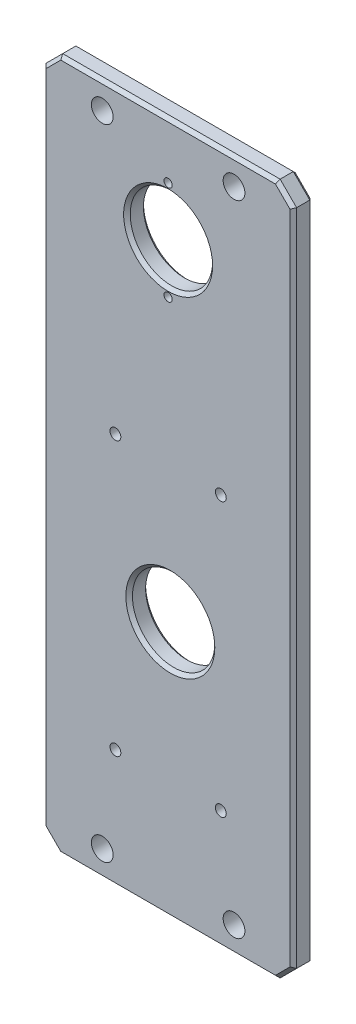
ISO-10303-21;
HEADER;
FILE_DESCRIPTION(('STEP AP214'),'2;1');
FILE_NAME('part.step','',(''),(''),'','','');
FILE_SCHEMA(('AUTOMOTIVE_DESIGN { 1 0 10303 214 1 1 1 1 }'));
ENDSEC;
DATA;
#1=APPLICATION_CONTEXT('core data for automotive mechanical design processes');
#2=APPLICATION_PROTOCOL_DEFINITION('international standard','automotive_design',2000,#1);
#3=PRODUCT_CONTEXT('',#1,'mechanical');
#4=PRODUCT('Part','Part','',(#3));
#5=PRODUCT_RELATED_PRODUCT_CATEGORY('part','',(#4));
#6=PRODUCT_DEFINITION_FORMATION('','',#4);
#7=PRODUCT_DEFINITION_CONTEXT('part definition',#1,'design');
#8=PRODUCT_DEFINITION('design','',#6,#7);
#9=PRODUCT_DEFINITION_SHAPE('','',#8);
#10=(LENGTH_UNIT() NAMED_UNIT(*) SI_UNIT(.MILLI.,.METRE.));
#11=(NAMED_UNIT(*) PLANE_ANGLE_UNIT() SI_UNIT($,.RADIAN.));
#12=(NAMED_UNIT(*) SI_UNIT($,.STERADIAN.) SOLID_ANGLE_UNIT());
#13=UNCERTAINTY_MEASURE_WITH_UNIT(LENGTH_MEASURE(1.E-05),#10,'distance_accuracy_value','');
#14=(GEOMETRIC_REPRESENTATION_CONTEXT(3) GLOBAL_UNCERTAINTY_ASSIGNED_CONTEXT((#13)) GLOBAL_UNIT_ASSIGNED_CONTEXT((#10,
#11,#12)) REPRESENTATION_CONTEXT('',''));
#15=CARTESIAN_POINT('',(0.,0.,0.));
#16=DIRECTION('',(0.,0.,1.));
#17=DIRECTION('',(1.,0.,0.));
#18=AXIS2_PLACEMENT_3D('',#15,#16,#17);
#19=CARTESIAN_POINT('',(38.,105.,6.));
#20=DIRECTION('',(-1.,0.,0.));
#21=DIRECTION('',(0.,-1.,0.));
#22=AXIS2_PLACEMENT_3D('',#19,#20,#21);
#23=PLANE('',#22);
#24=DIRECTION('',(0.,0.,1.));
#25=VECTOR('',#24,1.);
#26=CARTESIAN_POINT('',(38.,100.,6.));
#27=LINE('',#26,#25);
#28=CARTESIAN_POINT('',(38.,100.,1.));
#29=VERTEX_POINT('',#28);
#30=CARTESIAN_POINT('',(38.,100.,5.00000000000003));
#31=VERTEX_POINT('',#30);
#32=EDGE_CURVE('E625',#29,#31,#27,.T.);
#33=ORIENTED_EDGE('',*,*,#32,.T.);
#34=DIRECTION('',(0.,-1.,0.));
#35=VECTOR('',#34,1.);
#36=CARTESIAN_POINT('',(38.,-100.,5.00000000000003));
#37=LINE('',#36,#35);
#38=CARTESIAN_POINT('',(38.,-100.,5.00000000000003));
#39=VERTEX_POINT('',#38);
#40=EDGE_CURVE('E262',#31,#39,#37,.T.);
#41=ORIENTED_EDGE('',*,*,#40,.T.);
#42=DIRECTION('',(0.,0.,-1.));
#43=VECTOR('',#42,1.);
#44=CARTESIAN_POINT('',(38.,-100.,6.));
#45=LINE('',#44,#43);
#46=CARTESIAN_POINT('',(38.,-100.,1.));
#47=VERTEX_POINT('',#46);
#48=EDGE_CURVE('E666',#39,#47,#45,.T.);
#49=ORIENTED_EDGE('',*,*,#48,.T.);
#50=DIRECTION('',(0.,1.,0.));
#51=VECTOR('',#50,1.);
#52=CARTESIAN_POINT('',(38.,105.,1.));
#53=LINE('',#52,#51);
#54=EDGE_CURVE('E259',#47,#29,#53,.T.);
#55=ORIENTED_EDGE('',*,*,#54,.T.);
#56=EDGE_LOOP('',(#33,#41,#49,#55));
#57=FACE_BOUND('',#56,.T.);
#58=ADVANCED_FACE('F44',(#57),#23,.F.);
#59=CARTESIAN_POINT('',(-38.,105.,6.));
#60=DIRECTION('',(0.,-1.,0.));
#61=DIRECTION('',(0.,0.,-1.));
#62=AXIS2_PLACEMENT_3D('',#59,#60,#61);
#63=PLANE('',#62);
#64=DIRECTION('',(0.,0.,1.));
#65=VECTOR('',#64,1.);
#66=CARTESIAN_POINT('',(-33.,105.,6.));
#67=LINE('',#66,#65);
#68=CARTESIAN_POINT('',(-33.,105.,1.));
#69=VERTEX_POINT('',#68);
#70=CARTESIAN_POINT('',(-33.,105.,5.00000000000003));
#71=VERTEX_POINT('',#70);
#72=EDGE_CURVE('E190',#69,#71,#67,.T.);
#73=ORIENTED_EDGE('',*,*,#72,.T.);
#74=DIRECTION('',(1.,0.,0.));
#75=VECTOR('',#74,1.);
#76=CARTESIAN_POINT('',(33.,105.,5.00000000000003));
#77=LINE('',#76,#75);
#78=CARTESIAN_POINT('',(33.,105.,5.00000000000003));
#79=VERTEX_POINT('',#78);
#80=EDGE_CURVE('E226',#71,#79,#77,.T.);
#81=ORIENTED_EDGE('',*,*,#80,.T.);
#82=DIRECTION('',(0.,0.,-1.));
#83=VECTOR('',#82,1.);
#84=CARTESIAN_POINT('',(33.,105.,6.));
#85=LINE('',#84,#83);
#86=CARTESIAN_POINT('',(33.,105.,1.));
#87=VERTEX_POINT('',#86);
#88=EDGE_CURVE('E195',#79,#87,#85,.T.);
#89=ORIENTED_EDGE('',*,*,#88,.T.);
#90=DIRECTION('',(-1.,0.,0.));
#91=VECTOR('',#90,1.);
#92=CARTESIAN_POINT('',(-38.,105.,1.));
#93=LINE('',#92,#91);
#94=EDGE_CURVE('E223',#87,#69,#93,.T.);
#95=ORIENTED_EDGE('',*,*,#94,.T.);
#96=EDGE_LOOP('',(#73,#81,#89,#95));
#97=FACE_BOUND('',#96,.T.);
#98=ADVANCED_FACE('F381',(#97),#63,.F.);
#99=CARTESIAN_POINT('',(-38.,105.,6.));
#100=DIRECTION('',(1.,0.,0.));
#101=DIRECTION('',(0.,1.,0.));
#102=AXIS2_PLACEMENT_3D('',#99,#100,#101);
#103=PLANE('',#102);
#104=DIRECTION('',(0.,0.,1.));
#105=VECTOR('',#104,1.);
#106=CARTESIAN_POINT('',(-38.,-100.,6.));
#107=LINE('',#106,#105);
#108=CARTESIAN_POINT('',(-38.,-100.,1.));
#109=VERTEX_POINT('',#108);
#110=CARTESIAN_POINT('',(-38.,-100.,5.00000000000002));
#111=VERTEX_POINT('',#110);
#112=EDGE_CURVE('E617',#109,#111,#107,.T.);
#113=ORIENTED_EDGE('',*,*,#112,.T.);
#114=DIRECTION('',(0.,1.,0.));
#115=VECTOR('',#114,1.);
#116=CARTESIAN_POINT('',(-38.,100.,5.00000000000003));
#117=LINE('',#116,#115);
#118=CARTESIAN_POINT('',(-38.,100.,5.00000000000003));
#119=VERTEX_POINT('',#118);
#120=EDGE_CURVE('E238',#111,#119,#117,.T.);
#121=ORIENTED_EDGE('',*,*,#120,.T.);
#122=DIRECTION('',(0.,0.,-1.));
#123=VECTOR('',#122,1.);
#124=CARTESIAN_POINT('',(-38.,100.,6.));
#125=LINE('',#124,#123);
#126=CARTESIAN_POINT('',(-38.,100.,0.999999999999998));
#127=VERTEX_POINT('',#126);
#128=EDGE_CURVE('E626',#119,#127,#125,.T.);
#129=ORIENTED_EDGE('',*,*,#128,.T.);
#130=DIRECTION('',(0.,-1.,0.));
#131=VECTOR('',#130,1.);
#132=CARTESIAN_POINT('',(-38.,105.,1.));
#133=LINE('',#132,#131);
#134=EDGE_CURVE('E235',#127,#109,#133,.T.);
#135=ORIENTED_EDGE('',*,*,#134,.T.);
#136=EDGE_LOOP('',(#113,#121,#129,#135));
#137=FACE_BOUND('',#136,.T.);
#138=ADVANCED_FACE('F387',(#137),#103,.F.);
#139=CARTESIAN_POINT('',(-38.,-105.,6.));
#140=DIRECTION('',(0.,1.,0.));
#141=DIRECTION('',(0.,0.,1.));
#142=AXIS2_PLACEMENT_3D('',#139,#140,#141);
#143=PLANE('',#142);
#144=DIRECTION('',(0.,0.,1.));
#145=VECTOR('',#144,1.);
#146=CARTESIAN_POINT('',(33.,-105.,6.));
#147=LINE('',#146,#145);
#148=CARTESIAN_POINT('',(33.,-105.,1.));
#149=VERTEX_POINT('',#148);
#150=CARTESIAN_POINT('',(33.,-105.,5.00000000000002));
#151=VERTEX_POINT('',#150);
#152=EDGE_CURVE('E660',#149,#151,#147,.T.);
#153=ORIENTED_EDGE('',*,*,#152,.T.);
#154=DIRECTION('',(-1.,0.,0.));
#155=VECTOR('',#154,1.);
#156=CARTESIAN_POINT('',(-33.,-105.,5.00000000000003));
#157=LINE('',#156,#155);
#158=CARTESIAN_POINT('',(-33.,-105.,5.00000000000003));
#159=VERTEX_POINT('',#158);
#160=EDGE_CURVE('E250',#151,#159,#157,.T.);
#161=ORIENTED_EDGE('',*,*,#160,.T.);
#162=DIRECTION('',(0.,0.,-1.));
#163=VECTOR('',#162,1.);
#164=CARTESIAN_POINT('',(-33.,-105.,6.));
#165=LINE('',#164,#163);
#166=CARTESIAN_POINT('',(-33.,-105.,1.));
#167=VERTEX_POINT('',#166);
#168=EDGE_CURVE('E655',#159,#167,#165,.T.);
#169=ORIENTED_EDGE('',*,*,#168,.T.);
#170=DIRECTION('',(1.,0.,0.));
#171=VECTOR('',#170,1.);
#172=CARTESIAN_POINT('',(-38.,-105.,1.));
#173=LINE('',#172,#171);
#174=EDGE_CURVE('E247',#167,#149,#173,.T.);
#175=ORIENTED_EDGE('',*,*,#174,.T.);
#176=EDGE_LOOP('',(#153,#161,#169,#175));
#177=FACE_BOUND('',#176,.T.);
#178=ADVANCED_FACE('F604',(#177),#143,.F.);
#179=CARTESIAN_POINT('',(0.,0.,6.));
#180=DIRECTION('',(0.,0.,1.));
#181=DIRECTION('',(1.,0.,0.));
#182=AXIS2_PLACEMENT_3D('',#179,#180,#181);
#183=PLANE('',#182);
#184=CARTESIAN_POINT('',(0.670705331067708,-27.0196049970293,6.));
#185=DIRECTION('',(0.,0.,1.));
#186=DIRECTION('',(1.,0.,0.));
#187=AXIS2_PLACEMENT_3D('',#184,#185,#186);
#188=CIRCLE('',#187,13.5);
#189=CARTESIAN_POINT('',(14.1707053310677,-27.0196049970293,6.));
#190=VERTEX_POINT('',#189);
#191=EDGE_CURVE('E345',#190,#190,#188,.F.);
#192=ORIENTED_EDGE('',*,*,#191,.T.);
#193=EDGE_LOOP('',(#192));
#194=FACE_BOUND('',#193,.T.);
#195=CARTESIAN_POINT('',(0.,73.,6.));
#196=DIRECTION('',(0.,0.,1.));
#197=DIRECTION('',(1.,0.,0.));
#198=AXIS2_PLACEMENT_3D('',#195,#196,#197);
#199=CIRCLE('',#198,13.5);
#200=CARTESIAN_POINT('',(13.5,73.,6.));
#201=VERTEX_POINT('',#200);
#202=EDGE_CURVE('E288',#201,#201,#199,.F.);
#203=ORIENTED_EDGE('',*,*,#202,.T.);
#204=EDGE_LOOP('',(#203));
#205=FACE_BOUND('',#204,.T.);
#206=CARTESIAN_POINT('',(0.,58.,6.));
#207=DIRECTION('',(0.,0.,1.));
#208=DIRECTION('',(1.,0.,0.));
#209=AXIS2_PLACEMENT_3D('',#206,#207,#208);
#210=CIRCLE('',#209,1.25);
#211=CARTESIAN_POINT('',(1.24999999999999,58.,6.));
#212=VERTEX_POINT('',#211);
#213=EDGE_CURVE('E758',#212,#212,#210,.T.);
#214=ORIENTED_EDGE('',*,*,#213,.F.);
#215=EDGE_LOOP('',(#214));
#216=FACE_BOUND('',#215,.T.);
#217=CARTESIAN_POINT('',(0.,88.,6.));
#218=DIRECTION('',(0.,0.,1.));
#219=DIRECTION('',(1.,0.,0.));
#220=AXIS2_PLACEMENT_3D('',#217,#218,#219);
#221=CIRCLE('',#220,1.25);
#222=CARTESIAN_POINT('',(1.24999999999999,88.,6.));
#223=VERTEX_POINT('',#222);
#224=EDGE_CURVE('E750',#223,#223,#221,.T.);
#225=ORIENTED_EDGE('',*,*,#224,.F.);
#226=EDGE_LOOP('',(#225));
#227=FACE_BOUND('',#226,.T.);
#228=CARTESIAN_POINT('',(16.,14.0000000000019,6.));
#229=DIRECTION('',(0.,0.,1.));
#230=DIRECTION('',(1.,0.,0.));
#231=AXIS2_PLACEMENT_3D('',#228,#229,#230);
#232=CIRCLE('',#231,1.65);
#233=CARTESIAN_POINT('',(17.65,14.0000000000019,6.));
#234=VERTEX_POINT('',#233);
#235=EDGE_CURVE('E742',#234,#234,#232,.T.);
#236=ORIENTED_EDGE('',*,*,#235,.F.);
#237=EDGE_LOOP('',(#236));
#238=FACE_BOUND('',#237,.T.);
#239=CARTESIAN_POINT('',(-16.,14.0000000000019,6.));
#240=DIRECTION('',(0.,0.,1.));
#241=DIRECTION('',(1.,0.,0.));
#242=AXIS2_PLACEMENT_3D('',#239,#240,#241);
#243=CIRCLE('',#242,1.65);
#244=CARTESIAN_POINT('',(-14.35,14.0000000000019,6.));
#245=VERTEX_POINT('',#244);
#246=EDGE_CURVE('E734',#245,#245,#243,.T.);
#247=ORIENTED_EDGE('',*,*,#246,.F.);
#248=EDGE_LOOP('',(#247));
#249=FACE_BOUND('',#248,.T.);
#250=CARTESIAN_POINT('',(-16.,-68.9999999999981,6.));
#251=DIRECTION('',(0.,0.,1.));
#252=DIRECTION('',(1.,0.,0.));
#253=AXIS2_PLACEMENT_3D('',#250,#251,#252);
#254=CIRCLE('',#253,1.65);
#255=CARTESIAN_POINT('',(-14.35,-68.9999999999981,6.));
#256=VERTEX_POINT('',#255);
#257=EDGE_CURVE('E726',#256,#256,#254,.T.);
#258=ORIENTED_EDGE('',*,*,#257,.F.);
#259=EDGE_LOOP('',(#258));
#260=FACE_BOUND('',#259,.T.);
#261=CARTESIAN_POINT('',(16.,-68.9999999999981,6.));
#262=DIRECTION('',(0.,0.,1.));
#263=DIRECTION('',(1.,0.,0.));
#264=AXIS2_PLACEMENT_3D('',#261,#262,#263);
#265=CIRCLE('',#264,1.65);
#266=CARTESIAN_POINT('',(17.65,-68.9999999999981,6.));
#267=VERTEX_POINT('',#266);
#268=EDGE_CURVE('E316',#267,#267,#265,.T.);
#269=ORIENTED_EDGE('',*,*,#268,.F.);
#270=EDGE_LOOP('',(#269));
#271=FACE_BOUND('',#270,.T.);
#272=DIRECTION('',(0.,1.,0.));
#273=VECTOR('',#272,1.);
#274=CARTESIAN_POINT('',(37.,100.,6.));
#275=LINE('',#274,#273);
#276=CARTESIAN_POINT('',(37.,-99.5857864376269,6.));
#277=VERTEX_POINT('',#276);
#278=CARTESIAN_POINT('',(37.,99.585786437627,6.));
#279=VERTEX_POINT('',#278);
#280=EDGE_CURVE('E166',#277,#279,#275,.T.);
#281=ORIENTED_EDGE('',*,*,#280,.T.);
#282=DIRECTION('',(-0.707106781186546,0.707106781186549,0.));
#283=VECTOR('',#282,1.);
#284=CARTESIAN_POINT('',(68.2928932188136,68.2928932188132,6.));
#285=LINE('',#284,#283);
#286=CARTESIAN_POINT('',(32.5857864376269,104.,6.));
#287=VERTEX_POINT('',#286);
#288=EDGE_CURVE('E213',#279,#287,#285,.T.);
#289=ORIENTED_EDGE('',*,*,#288,.T.);
#290=DIRECTION('',(-1.,0.,0.));
#291=VECTOR('',#290,1.);
#292=CARTESIAN_POINT('',(-33.,104.,6.));
#293=LINE('',#292,#291);
#294=CARTESIAN_POINT('',(-32.5857864376269,104.,6.));
#295=VERTEX_POINT('',#294);
#296=EDGE_CURVE('E210',#287,#295,#293,.T.);
#297=ORIENTED_EDGE('',*,*,#296,.T.);
#298=DIRECTION('',(-0.707106781186548,-0.707106781186548,0.));
#299=VECTOR('',#298,1.);
#300=CARTESIAN_POINT('',(-68.2928932188135,68.2928932188135,6.));
#301=LINE('',#300,#299);
#302=CARTESIAN_POINT('',(-37.,99.585786437627,6.));
#303=VERTEX_POINT('',#302);
#304=EDGE_CURVE('E207',#295,#303,#301,.T.);
#305=ORIENTED_EDGE('',*,*,#304,.T.);
#306=DIRECTION('',(0.,-1.,0.));
#307=VECTOR('',#306,1.);
#308=CARTESIAN_POINT('',(-37.,-100.,6.));
#309=LINE('',#308,#307);
#310=CARTESIAN_POINT('',(-37.,-99.5857864376269,6.));
#311=VERTEX_POINT('',#310);
#312=EDGE_CURVE('E204',#303,#311,#309,.T.);
#313=ORIENTED_EDGE('',*,*,#312,.T.);
#314=DIRECTION('',(0.707106781186546,-0.707106781186549,0.));
#315=VECTOR('',#314,1.);
#316=CARTESIAN_POINT('',(-68.2928932188136,-68.2928932188132,6.));
#317=LINE('',#316,#315);
#318=CARTESIAN_POINT('',(-32.5857864376269,-104.,6.));
#319=VERTEX_POINT('',#318);
#320=EDGE_CURVE('E201',#311,#319,#317,.T.);
#321=ORIENTED_EDGE('',*,*,#320,.T.);
#322=DIRECTION('',(1.,0.,0.));
#323=VECTOR('',#322,1.);
#324=CARTESIAN_POINT('',(33.,-104.,6.));
#325=LINE('',#324,#323);
#326=CARTESIAN_POINT('',(32.5857864376269,-104.,6.));
#327=VERTEX_POINT('',#326);
#328=EDGE_CURVE('E169',#319,#327,#325,.T.);
#329=ORIENTED_EDGE('',*,*,#328,.T.);
#330=DIRECTION('',(0.707106781186549,0.707106781186546,0.));
#331=VECTOR('',#330,1.);
#332=CARTESIAN_POINT('',(68.2928932188134,-68.2928932188137,6.));
#333=LINE('',#332,#331);
#334=EDGE_CURVE('E160',#327,#277,#333,.T.);
#335=ORIENTED_EDGE('',*,*,#334,.T.);
#336=EDGE_LOOP('',(#281,#289,#297,#305,#313,#321,#329,#335));
#337=FACE_BOUND('',#336,.T.);
#338=CARTESIAN_POINT('',(20.,97.,6.));
#339=DIRECTION('',(0.,0.,1.));
#340=DIRECTION('',(1.,0.,0.));
#341=AXIS2_PLACEMENT_3D('',#338,#339,#340);
#342=CIRCLE('',#341,3.3);
#343=CARTESIAN_POINT('',(23.3,97.,6.));
#344=VERTEX_POINT('',#343);
#345=EDGE_CURVE('E706',#344,#344,#342,.T.);
#346=ORIENTED_EDGE('',*,*,#345,.F.);
#347=EDGE_LOOP('',(#346));
#348=FACE_BOUND('',#347,.T.);
#349=CARTESIAN_POINT('',(-20.,-97.,6.));
#350=DIRECTION('',(0.,0.,1.));
#351=DIRECTION('',(1.,0.,0.));
#352=AXIS2_PLACEMENT_3D('',#349,#350,#351);
#353=CIRCLE('',#352,3.3);
#354=CARTESIAN_POINT('',(-16.7,-97.,6.));
#355=VERTEX_POINT('',#354);
#356=EDGE_CURVE('E697',#355,#355,#353,.T.);
#357=ORIENTED_EDGE('',*,*,#356,.F.);
#358=EDGE_LOOP('',(#357));
#359=FACE_BOUND('',#358,.T.);
#360=CARTESIAN_POINT('',(20.,-97.,6.));
#361=DIRECTION('',(0.,0.,1.));
#362=DIRECTION('',(1.,0.,0.));
#363=AXIS2_PLACEMENT_3D('',#360,#361,#362);
#364=CIRCLE('',#363,3.3);
#365=CARTESIAN_POINT('',(23.3,-97.,6.));
#366=VERTEX_POINT('',#365);
#367=EDGE_CURVE('E312',#366,#366,#364,.T.);
#368=ORIENTED_EDGE('',*,*,#367,.F.);
#369=EDGE_LOOP('',(#368));
#370=FACE_BOUND('',#369,.T.);
#371=CARTESIAN_POINT('',(-20.,97.,6.));
#372=DIRECTION('',(0.,0.,1.));
#373=DIRECTION('',(1.,0.,0.));
#374=AXIS2_PLACEMENT_3D('',#371,#372,#373);
#375=CIRCLE('',#374,3.3);
#376=CARTESIAN_POINT('',(-16.7,97.,6.));
#377=VERTEX_POINT('',#376);
#378=EDGE_CURVE('E690',#377,#377,#375,.T.);
#379=ORIENTED_EDGE('',*,*,#378,.F.);
#380=EDGE_LOOP('',(#379));
#381=FACE_BOUND('',#380,.T.);
#382=ADVANCED_FACE('F162',(#194,#205,#216,#227,#238,#249,#260,#271,#337,#348,#359,#370,#381),
#183,.T.);
#383=CARTESIAN_POINT('',(0.,0.,0.));
#384=DIRECTION('',(0.,0.,1.));
#385=DIRECTION('',(1.,0.,0.));
#386=AXIS2_PLACEMENT_3D('',#383,#384,#385);
#387=PLANE('',#386);
#388=CARTESIAN_POINT('',(0.670705331067708,-27.0196049970293,0.));
#389=DIRECTION('',(0.,0.,1.));
#390=DIRECTION('',(1.,0.,0.));
#391=AXIS2_PLACEMENT_3D('',#388,#389,#390);
#392=CIRCLE('',#391,13.5);
#393=CARTESIAN_POINT('',(14.1707053310677,-27.0196049970293,0.));
#394=VERTEX_POINT('',#393);
#395=EDGE_CURVE('E361',#394,#394,#392,.T.);
#396=ORIENTED_EDGE('',*,*,#395,.T.);
#397=EDGE_LOOP('',(#396));
#398=FACE_BOUND('',#397,.T.);
#399=CARTESIAN_POINT('',(0.,73.,0.));
#400=DIRECTION('',(0.,0.,1.));
#401=DIRECTION('',(1.,0.,0.));
#402=AXIS2_PLACEMENT_3D('',#399,#400,#401);
#403=CIRCLE('',#402,13.5);
#404=CARTESIAN_POINT('',(13.5,73.,0.));
#405=VERTEX_POINT('',#404);
#406=EDGE_CURVE('E357',#405,#405,#403,.T.);
#407=ORIENTED_EDGE('',*,*,#406,.T.);
#408=EDGE_LOOP('',(#407));
#409=FACE_BOUND('',#408,.T.);
#410=CARTESIAN_POINT('',(0.,58.,0.));
#411=DIRECTION('',(0.,0.,-1.));
#412=DIRECTION('',(-1.,0.,0.));
#413=AXIS2_PLACEMENT_3D('',#410,#411,#412);
#414=CIRCLE('',#413,1.25);
#415=CARTESIAN_POINT('',(-1.25000000000001,58.,0.));
#416=VERTEX_POINT('',#415);
#417=EDGE_CURVE('E762',#416,#416,#414,.T.);
#418=ORIENTED_EDGE('',*,*,#417,.F.);
#419=EDGE_LOOP('',(#418));
#420=FACE_BOUND('',#419,.T.);
#421=CARTESIAN_POINT('',(0.,88.,0.));
#422=DIRECTION('',(0.,0.,-1.));
#423=DIRECTION('',(-1.,0.,0.));
#424=AXIS2_PLACEMENT_3D('',#421,#422,#423);
#425=CIRCLE('',#424,1.25);
#426=CARTESIAN_POINT('',(-1.25000000000001,88.,0.));
#427=VERTEX_POINT('',#426);
#428=EDGE_CURVE('E754',#427,#427,#425,.T.);
#429=ORIENTED_EDGE('',*,*,#428,.F.);
#430=EDGE_LOOP('',(#429));
#431=FACE_BOUND('',#430,.T.);
#432=CARTESIAN_POINT('',(16.,14.0000000000019,0.));
#433=DIRECTION('',(0.,0.,-1.));
#434=DIRECTION('',(-1.,0.,0.));
#435=AXIS2_PLACEMENT_3D('',#432,#433,#434);
#436=CIRCLE('',#435,1.65);
#437=CARTESIAN_POINT('',(14.35,14.0000000000019,0.));
#438=VERTEX_POINT('',#437);
#439=EDGE_CURVE('E746',#438,#438,#436,.T.);
#440=ORIENTED_EDGE('',*,*,#439,.F.);
#441=EDGE_LOOP('',(#440));
#442=FACE_BOUND('',#441,.T.);
#443=CARTESIAN_POINT('',(-16.,14.0000000000019,0.));
#444=DIRECTION('',(0.,0.,-1.));
#445=DIRECTION('',(-1.,0.,0.));
#446=AXIS2_PLACEMENT_3D('',#443,#444,#445);
#447=CIRCLE('',#446,1.65);
#448=CARTESIAN_POINT('',(-17.65,14.0000000000019,0.));
#449=VERTEX_POINT('',#448);
#450=EDGE_CURVE('E738',#449,#449,#447,.T.);
#451=ORIENTED_EDGE('',*,*,#450,.F.);
#452=EDGE_LOOP('',(#451));
#453=FACE_BOUND('',#452,.T.);
#454=CARTESIAN_POINT('',(-16.,-68.9999999999981,0.));
#455=DIRECTION('',(0.,0.,-1.));
#456=DIRECTION('',(-1.,0.,0.));
#457=AXIS2_PLACEMENT_3D('',#454,#455,#456);
#458=CIRCLE('',#457,1.65);
#459=CARTESIAN_POINT('',(-17.65,-68.9999999999981,0.));
#460=VERTEX_POINT('',#459);
#461=EDGE_CURVE('E730',#460,#460,#458,.T.);
#462=ORIENTED_EDGE('',*,*,#461,.F.);
#463=EDGE_LOOP('',(#462));
#464=FACE_BOUND('',#463,.T.);
#465=CARTESIAN_POINT('',(16.,-68.9999999999981,0.));
#466=DIRECTION('',(0.,0.,-1.));
#467=DIRECTION('',(-1.,0.,0.));
#468=AXIS2_PLACEMENT_3D('',#465,#466,#467);
#469=CIRCLE('',#468,1.65);
#470=CARTESIAN_POINT('',(14.35,-68.9999999999981,0.));
#471=VERTEX_POINT('',#470);
#472=EDGE_CURVE('E722',#471,#471,#469,.T.);
#473=ORIENTED_EDGE('',*,*,#472,.F.);
#474=EDGE_LOOP('',(#473));
#475=FACE_BOUND('',#474,.T.);
#476=DIRECTION('',(0.,-1.,0.));
#477=VECTOR('',#476,1.);
#478=CARTESIAN_POINT('',(37.,0.,0.));
#479=LINE('',#478,#477);
#480=CARTESIAN_POINT('',(37.,99.5857864376269,0.));
#481=VERTEX_POINT('',#480);
#482=CARTESIAN_POINT('',(37.,-99.5857864376269,0.));
#483=VERTEX_POINT('',#482);
#484=EDGE_CURVE('E265',#481,#483,#479,.T.);
#485=ORIENTED_EDGE('',*,*,#484,.T.);
#486=DIRECTION('',(-0.707106781186549,-0.707106781186546,0.));
#487=VECTOR('',#486,1.);
#488=CARTESIAN_POINT('',(32.2928932188134,-104.292893218813,0.));
#489=LINE('',#488,#487);
#490=CARTESIAN_POINT('',(32.5857864376269,-104.,0.));
#491=VERTEX_POINT('',#490);
#492=EDGE_CURVE('E285',#483,#491,#489,.T.);
#493=ORIENTED_EDGE('',*,*,#492,.T.);
#494=DIRECTION('',(-1.,0.,0.));
#495=VECTOR('',#494,1.);
#496=CARTESIAN_POINT('',(0.,-104.,0.));
#497=LINE('',#496,#495);
#498=CARTESIAN_POINT('',(-32.5857864376269,-104.,0.));
#499=VERTEX_POINT('',#498);
#500=EDGE_CURVE('E68',#491,#499,#497,.T.);
#501=ORIENTED_EDGE('',*,*,#500,.T.);
#502=DIRECTION('',(-0.707106781186546,0.707106781186549,0.));
#503=VECTOR('',#502,1.);
#504=CARTESIAN_POINT('',(-37.2928932188134,-99.2928932188134,0.));
#505=LINE('',#504,#503);
#506=CARTESIAN_POINT('',(-37.,-99.5857864376269,0.));
#507=VERTEX_POINT('',#506);
#508=EDGE_CURVE('E280',#499,#507,#505,.T.);
#509=ORIENTED_EDGE('',*,*,#508,.T.);
#510=DIRECTION('',(0.,1.,0.));
#511=VECTOR('',#510,1.);
#512=CARTESIAN_POINT('',(-37.,0.,0.));
#513=LINE('',#512,#511);
#514=CARTESIAN_POINT('',(-37.,99.5857864376269,0.));
#515=VERTEX_POINT('',#514);
#516=EDGE_CURVE('E277',#507,#515,#513,.T.);
#517=ORIENTED_EDGE('',*,*,#516,.T.);
#518=DIRECTION('',(0.707106781186548,0.707106781186548,0.));
#519=VECTOR('',#518,1.);
#520=CARTESIAN_POINT('',(-32.2928932188135,104.292893218813,0.));
#521=LINE('',#520,#519);
#522=CARTESIAN_POINT('',(-32.5857864376269,104.,0.));
#523=VERTEX_POINT('',#522);
#524=EDGE_CURVE('E274',#515,#523,#521,.T.);
#525=ORIENTED_EDGE('',*,*,#524,.T.);
#526=DIRECTION('',(1.,0.,0.));
#527=VECTOR('',#526,1.);
#528=CARTESIAN_POINT('',(0.,104.,0.));
#529=LINE('',#528,#527);
#530=CARTESIAN_POINT('',(32.5857864376269,104.,0.));
#531=VERTEX_POINT('',#530);
#532=EDGE_CURVE('E271',#523,#531,#529,.T.);
#533=ORIENTED_EDGE('',*,*,#532,.T.);
#534=DIRECTION('',(0.707106781186546,-0.707106781186549,0.));
#535=VECTOR('',#534,1.);
#536=CARTESIAN_POINT('',(37.2928932188134,99.2928932188135,0.));
#537=LINE('',#536,#535);
#538=EDGE_CURVE('E268',#531,#481,#537,.T.);
#539=ORIENTED_EDGE('',*,*,#538,.T.);
#540=EDGE_LOOP('',(#485,#493,#501,#509,#517,#525,#533,#539));
#541=FACE_BOUND('',#540,.T.);
#542=CARTESIAN_POINT('',(20.,97.,0.));
#543=DIRECTION('',(0.,0.,1.));
#544=DIRECTION('',(1.,0.,0.));
#545=AXIS2_PLACEMENT_3D('',#542,#543,#544);
#546=CIRCLE('',#545,3.3);
#547=CARTESIAN_POINT('',(23.3,97.,0.));
#548=VERTEX_POINT('',#547);
#549=EDGE_CURVE('E695',#548,#548,#546,.T.);
#550=ORIENTED_EDGE('',*,*,#549,.T.);
#551=EDGE_LOOP('',(#550));
#552=FACE_BOUND('',#551,.T.);
#553=CARTESIAN_POINT('',(-20.,-97.,0.));
#554=DIRECTION('',(0.,0.,1.));
#555=DIRECTION('',(1.,0.,0.));
#556=AXIS2_PLACEMENT_3D('',#553,#554,#555);
#557=CIRCLE('',#556,3.3);
#558=CARTESIAN_POINT('',(-16.7,-97.,0.));
#559=VERTEX_POINT('',#558);
#560=EDGE_CURVE('E701',#559,#559,#557,.T.);
#561=ORIENTED_EDGE('',*,*,#560,.T.);
#562=EDGE_LOOP('',(#561));
#563=FACE_BOUND('',#562,.T.);
#564=CARTESIAN_POINT('',(20.,-97.,0.));
#565=DIRECTION('',(0.,0.,1.));
#566=DIRECTION('',(1.,0.,0.));
#567=AXIS2_PLACEMENT_3D('',#564,#565,#566);
#568=CIRCLE('',#567,3.3);
#569=CARTESIAN_POINT('',(23.3,-97.,0.));
#570=VERTEX_POINT('',#569);
#571=EDGE_CURVE('E702',#570,#570,#568,.T.);
#572=ORIENTED_EDGE('',*,*,#571,.T.);
#573=EDGE_LOOP('',(#572));
#574=FACE_BOUND('',#573,.T.);
#575=CARTESIAN_POINT('',(-20.,97.,0.));
#576=DIRECTION('',(0.,0.,1.));
#577=DIRECTION('',(1.,0.,0.));
#578=AXIS2_PLACEMENT_3D('',#575,#576,#577);
#579=CIRCLE('',#578,3.3);
#580=CARTESIAN_POINT('',(-16.7,97.,0.));
#581=VERTEX_POINT('',#580);
#582=EDGE_CURVE('E686',#581,#581,#579,.T.);
#583=ORIENTED_EDGE('',*,*,#582,.T.);
#584=EDGE_LOOP('',(#583));
#585=FACE_BOUND('',#584,.T.);
#586=ADVANCED_FACE('F600',(#398,#409,#420,#431,#442,#453,#464,#475,#541,#552,#563,#574,#585),
#387,.F.);
#587=CARTESIAN_POINT('',(-20.,97.,0.));
#588=DIRECTION('',(0.,0.,1.));
#589=DIRECTION('',(1.,0.,0.));
#590=AXIS2_PLACEMENT_3D('',#587,#588,#589);
#591=CYLINDRICAL_SURFACE('',#590,3.3);
#592=ORIENTED_EDGE('',*,*,#582,.F.);
#593=EDGE_LOOP('',(#592));
#594=FACE_BOUND('',#593,.T.);
#595=ORIENTED_EDGE('',*,*,#378,.T.);
#596=EDGE_LOOP('',(#595));
#597=FACE_BOUND('',#596,.T.);
#598=ADVANCED_FACE('F590',(#594,#597),#591,.F.);
#599=CARTESIAN_POINT('',(20.,-97.,0.));
#600=DIRECTION('',(0.,0.,1.));
#601=DIRECTION('',(1.,0.,0.));
#602=AXIS2_PLACEMENT_3D('',#599,#600,#601);
#603=CYLINDRICAL_SURFACE('',#602,3.3);
#604=ORIENTED_EDGE('',*,*,#571,.F.);
#605=EDGE_LOOP('',(#604));
#606=FACE_BOUND('',#605,.T.);
#607=ORIENTED_EDGE('',*,*,#367,.T.);
#608=EDGE_LOOP('',(#607));
#609=FACE_BOUND('',#608,.T.);
#610=ADVANCED_FACE('F586',(#606,#609),#603,.F.);
#611=CARTESIAN_POINT('',(-20.,-97.,0.));
#612=DIRECTION('',(0.,0.,1.));
#613=DIRECTION('',(1.,0.,0.));
#614=AXIS2_PLACEMENT_3D('',#611,#612,#613);
#615=CYLINDRICAL_SURFACE('',#614,3.3);
#616=ORIENTED_EDGE('',*,*,#560,.F.);
#617=EDGE_LOOP('',(#616));
#618=FACE_BOUND('',#617,.T.);
#619=ORIENTED_EDGE('',*,*,#356,.T.);
#620=EDGE_LOOP('',(#619));
#621=FACE_BOUND('',#620,.T.);
#622=ADVANCED_FACE('F589',(#618,#621),#615,.F.);
#623=CARTESIAN_POINT('',(20.,97.,0.));
#624=DIRECTION('',(0.,0.,1.));
#625=DIRECTION('',(1.,0.,0.));
#626=AXIS2_PLACEMENT_3D('',#623,#624,#625);
#627=CYLINDRICAL_SURFACE('',#626,3.3);
#628=ORIENTED_EDGE('',*,*,#549,.F.);
#629=EDGE_LOOP('',(#628));
#630=FACE_BOUND('',#629,.T.);
#631=ORIENTED_EDGE('',*,*,#345,.T.);
#632=EDGE_LOOP('',(#631));
#633=FACE_BOUND('',#632,.T.);
#634=ADVANCED_FACE('F401',(#630,#633),#627,.F.);
#635=CARTESIAN_POINT('',(-33.,-105.,6.));
#636=DIRECTION('',(0.707106781186549,0.707106781186546,0.));
#637=DIRECTION('',(0.,0.,-1.));
#638=AXIS2_PLACEMENT_3D('',#635,#636,#637);
#639=PLANE('',#638);
#640=ORIENTED_EDGE('',*,*,#168,.F.);
#641=DIRECTION('',(0.707106781186546,-0.707106781186549,0.));
#642=VECTOR('',#641,1.);
#643=CARTESIAN_POINT('',(-33.,-105.,5.00000000000002));
#644=LINE('',#643,#642);
#645=EDGE_CURVE('E244',#159,#111,#644,.F.);
#646=ORIENTED_EDGE('',*,*,#645,.T.);
#647=ORIENTED_EDGE('',*,*,#112,.F.);
#648=DIRECTION('',(-0.707106781186546,0.707106781186549,0.));
#649=VECTOR('',#648,1.);
#650=CARTESIAN_POINT('',(-33.,-105.,1.));
#651=LINE('',#650,#649);
#652=EDGE_CURVE('E241',#109,#167,#651,.F.);
#653=ORIENTED_EDGE('',*,*,#652,.T.);
#654=EDGE_LOOP('',(#640,#646,#647,#653));
#655=FACE_BOUND('',#654,.T.);
#656=ADVANCED_FACE('F394',(#655),#639,.F.);
#657=CARTESIAN_POINT('',(38.,-100.,6.));
#658=DIRECTION('',(-0.707106781186545,0.707106781186549,0.));
#659=DIRECTION('',(0.,0.,-1.));
#660=AXIS2_PLACEMENT_3D('',#657,#658,#659);
#661=PLANE('',#660);
#662=ORIENTED_EDGE('',*,*,#48,.F.);
#663=DIRECTION('',(0.707106781186549,0.707106781186546,0.));
#664=VECTOR('',#663,1.);
#665=CARTESIAN_POINT('',(38.,-100.,5.00000000000002));
#666=LINE('',#665,#664);
#667=EDGE_CURVE('E179',#39,#151,#666,.F.);
#668=ORIENTED_EDGE('',*,*,#667,.T.);
#669=ORIENTED_EDGE('',*,*,#152,.F.);
#670=DIRECTION('',(-0.707106781186549,-0.707106781186546,0.));
#671=VECTOR('',#670,1.);
#672=CARTESIAN_POINT('',(38.,-100.,1.));
#673=LINE('',#672,#671);
#674=EDGE_CURVE('E253',#149,#47,#673,.F.);
#675=ORIENTED_EDGE('',*,*,#674,.T.);
#676=EDGE_LOOP('',(#662,#668,#669,#675));
#677=FACE_BOUND('',#676,.T.);
#678=ADVANCED_FACE('F400',(#677),#661,.F.);
#679=CARTESIAN_POINT('',(-38.,100.,6.));
#680=DIRECTION('',(0.707106781186548,-0.707106781186548,0.));
#681=DIRECTION('',(0.,0.,-1.));
#682=AXIS2_PLACEMENT_3D('',#679,#680,#681);
#683=PLANE('',#682);
#684=ORIENTED_EDGE('',*,*,#128,.F.);
#685=DIRECTION('',(-0.707106781186548,-0.707106781186548,0.));
#686=VECTOR('',#685,1.);
#687=CARTESIAN_POINT('',(-38.,100.,5.00000000000003));
#688=LINE('',#687,#686);
#689=EDGE_CURVE('E232',#119,#71,#688,.F.);
#690=ORIENTED_EDGE('',*,*,#689,.T.);
#691=ORIENTED_EDGE('',*,*,#72,.F.);
#692=DIRECTION('',(0.707106781186548,0.707106781186548,0.));
#693=VECTOR('',#692,1.);
#694=CARTESIAN_POINT('',(-38.,100.,0.999999999999999));
#695=LINE('',#694,#693);
#696=EDGE_CURVE('E229',#69,#127,#695,.F.);
#697=ORIENTED_EDGE('',*,*,#696,.T.);
#698=EDGE_LOOP('',(#684,#690,#691,#697));
#699=FACE_BOUND('',#698,.T.);
#700=ADVANCED_FACE('F408',(#699),#683,.F.);
#701=CARTESIAN_POINT('',(33.,105.,6.));
#702=DIRECTION('',(-0.707106781186549,-0.707106781186546,0.));
#703=DIRECTION('',(0.,0.,-1.));
#704=AXIS2_PLACEMENT_3D('',#701,#702,#703);
#705=PLANE('',#704);
#706=ORIENTED_EDGE('',*,*,#88,.F.);
#707=DIRECTION('',(-0.707106781186546,0.707106781186549,0.));
#708=VECTOR('',#707,1.);
#709=CARTESIAN_POINT('',(33.,105.,5.00000000000003));
#710=LINE('',#709,#708);
#711=EDGE_CURVE('E219',#79,#31,#710,.F.);
#712=ORIENTED_EDGE('',*,*,#711,.T.);
#713=ORIENTED_EDGE('',*,*,#32,.F.);
#714=DIRECTION('',(0.707106781186546,-0.707106781186549,0.));
#715=VECTOR('',#714,1.);
#716=CARTESIAN_POINT('',(33.,105.,1.));
#717=LINE('',#716,#715);
#718=EDGE_CURVE('E216',#29,#87,#717,.F.);
#719=ORIENTED_EDGE('',*,*,#718,.T.);
#720=EDGE_LOOP('',(#706,#712,#713,#719));
#721=FACE_BOUND('',#720,.T.);
#722=ADVANCED_FACE('F415',(#721),#705,.F.);
#723=CARTESIAN_POINT('',(-68.2928932188136,-68.2928932188132,6.));
#724=DIRECTION('',(-0.500000000000001,-0.499999999999998,0.707106781186549));
#725=DIRECTION('',(-0.707106781186546,0.707106781186549,0.));
#726=AXIS2_PLACEMENT_3D('',#723,#724,#725);
#727=PLANE('',#726);
#728=DIRECTION('',(-0.678598344545847,-0.281084637714822,-0.678598344545847));
#729=VECTOR('',#728,1.);
#730=CARTESIAN_POINT('',(-45.4413250186436,-103.082297744748,-2.44132501864356));
#731=LINE('',#730,#729);
#732=EDGE_CURVE('E304',#111,#311,#731,.F.);
#733=ORIENTED_EDGE('',*,*,#732,.F.);
#734=ORIENTED_EDGE('',*,*,#645,.F.);
#735=DIRECTION('',(-0.281084637714824,-0.678598344545846,-0.678598344545846));
#736=VECTOR('',#735,1.);
#737=CARTESIAN_POINT('',(-30.0112299328829,-97.7844707691512,12.2155292308488));
#738=LINE('',#737,#736);
#739=EDGE_CURVE('E308',#319,#159,#738,.T.);
#740=ORIENTED_EDGE('',*,*,#739,.F.);
#741=ORIENTED_EDGE('',*,*,#320,.F.);
#742=EDGE_LOOP('',(#733,#734,#740,#741));
#743=FACE_BOUND('',#742,.T.);
#744=ADVANCED_FACE('F422',(#743),#727,.T.);
#745=CARTESIAN_POINT('',(0.,-104.,6.));
#746=DIRECTION('',(0.,-0.707106781186548,0.707106781186548));
#747=DIRECTION('',(-1.,0.,0.));
#748=AXIS2_PLACEMENT_3D('',#745,#746,#747);
#749=PLANE('',#748);
#750=ORIENTED_EDGE('',*,*,#739,.T.);
#751=ORIENTED_EDGE('',*,*,#160,.F.);
#752=DIRECTION('',(0.281084637714801,-0.678598344545851,-0.678598344545851));
#753=VECTOR('',#752,1.);
#754=CARTESIAN_POINT('',(28.5960529945731,-94.3679314115253,15.6320685884747));
#755=LINE('',#754,#753);
#756=EDGE_CURVE('E301',#327,#151,#755,.T.);
#757=ORIENTED_EDGE('',*,*,#756,.F.);
#758=ORIENTED_EDGE('',*,*,#328,.F.);
#759=EDGE_LOOP('',(#750,#751,#757,#758));
#760=FACE_BOUND('',#759,.T.);
#761=ADVANCED_FACE('F464',(#760),#749,.T.);
#762=CARTESIAN_POINT('',(-37.,0.,6.));
#763=DIRECTION('',(-0.707106781186548,0.,0.707106781186548));
#764=DIRECTION('',(0.,1.,0.));
#765=AXIS2_PLACEMENT_3D('',#762,#763,#764);
#766=PLANE('',#765);
#767=ORIENTED_EDGE('',*,*,#732,.T.);
#768=ORIENTED_EDGE('',*,*,#312,.F.);
#769=DIRECTION('',(-0.678598344545846,0.281084637714826,-0.678598344545846));
#770=VECTOR('',#769,1.);
#771=CARTESIAN_POINT('',(-18.0046515905043,91.7176555044114,24.9953484094957));
#772=LINE('',#771,#770);
#773=EDGE_CURVE('E183',#119,#303,#772,.F.);
#774=ORIENTED_EDGE('',*,*,#773,.F.);
#775=ORIENTED_EDGE('',*,*,#120,.F.);
#776=EDGE_LOOP('',(#767,#768,#774,#775));
#777=FACE_BOUND('',#776,.T.);
#778=ADVANCED_FACE('F458',(#777),#766,.T.);
#779=CARTESIAN_POINT('',(68.2928932188134,-68.2928932188137,6.));
#780=DIRECTION('',(0.500000000000004,-0.500000000000007,0.70710678118654));
#781=DIRECTION('',(-0.707106781186549,-0.707106781186546,0.));
#782=AXIS2_PLACEMENT_3D('',#779,#780,#781);
#783=PLANE('',#782);
#784=ORIENTED_EDGE('',*,*,#756,.T.);
#785=ORIENTED_EDGE('',*,*,#667,.F.);
#786=DIRECTION('',(0.678598344545851,-0.281084637714803,-0.678598344545851));
#787=VECTOR('',#786,1.);
#788=CARTESIAN_POINT('',(18.0046515905058,-91.7176555044127,24.9953484094943));
#789=LINE('',#788,#787);
#790=EDGE_CURVE('E177',#277,#39,#789,.T.);
#791=ORIENTED_EDGE('',*,*,#790,.F.);
#792=ORIENTED_EDGE('',*,*,#334,.F.);
#793=EDGE_LOOP('',(#784,#785,#791,#792));
#794=FACE_BOUND('',#793,.T.);
#795=ADVANCED_FACE('F178',(#794),#783,.T.);
#796=CARTESIAN_POINT('',(-68.2928932188135,68.2928932188135,6.));
#797=DIRECTION('',(-0.499999999999998,0.499999999999998,0.70710678118655));
#798=DIRECTION('',(0.707106781186548,0.707106781186548,0.));
#799=AXIS2_PLACEMENT_3D('',#796,#797,#798);
#800=PLANE('',#799);
#801=ORIENTED_EDGE('',*,*,#773,.T.);
#802=ORIENTED_EDGE('',*,*,#304,.F.);
#803=DIRECTION('',(-0.281084637714826,0.678598344545846,-0.678598344545846));
#804=VECTOR('',#803,1.);
#805=CARTESIAN_POINT('',(-28.5960529945731,94.3679314115261,15.632068588474));
#806=LINE('',#805,#804);
#807=EDGE_CURVE('E184',#71,#295,#806,.F.);
#808=ORIENTED_EDGE('',*,*,#807,.F.);
#809=ORIENTED_EDGE('',*,*,#689,.F.);
#810=EDGE_LOOP('',(#801,#802,#808,#809));
#811=FACE_BOUND('',#810,.T.);
#812=ADVANCED_FACE('F446',(#811),#800,.T.);
#813=CARTESIAN_POINT('',(37.,0.,6.));
#814=DIRECTION('',(0.707106781186548,0.,0.707106781186548));
#815=DIRECTION('',(0.,-1.,0.));
#816=AXIS2_PLACEMENT_3D('',#813,#814,#815);
#817=PLANE('',#816);
#818=ORIENTED_EDGE('',*,*,#790,.T.);
#819=ORIENTED_EDGE('',*,*,#40,.F.);
#820=DIRECTION('',(-0.678598344545848,-0.281084637714816,0.678598344545848));
#821=VECTOR('',#820,1.);
#822=CARTESIAN_POINT('',(18.0046515905049,91.717655504412,24.9953484094951));
#823=LINE('',#822,#821);
#824=EDGE_CURVE('E187',#279,#31,#823,.F.);
#825=ORIENTED_EDGE('',*,*,#824,.F.);
#826=ORIENTED_EDGE('',*,*,#280,.F.);
#827=EDGE_LOOP('',(#818,#819,#825,#826));
#828=FACE_BOUND('',#827,.T.);
#829=ADVANCED_FACE('F186',(#828),#817,.T.);
#830=CARTESIAN_POINT('',(0.,104.,6.));
#831=DIRECTION('',(0.,0.707106781186548,0.707106781186548));
#832=DIRECTION('',(1.,0.,0.));
#833=AXIS2_PLACEMENT_3D('',#830,#831,#832);
#834=PLANE('',#833);
#835=ORIENTED_EDGE('',*,*,#807,.T.);
#836=ORIENTED_EDGE('',*,*,#296,.F.);
#837=DIRECTION('',(0.281084637714818,0.678598344545848,-0.678598344545848));
#838=VECTOR('',#837,1.);
#839=CARTESIAN_POINT('',(30.011229932883,97.7844707691513,12.2155292308487));
#840=LINE('',#839,#838);
#841=EDGE_CURVE('E289',#79,#287,#840,.F.);
#842=ORIENTED_EDGE('',*,*,#841,.F.);
#843=ORIENTED_EDGE('',*,*,#80,.F.);
#844=EDGE_LOOP('',(#835,#836,#842,#843));
#845=FACE_BOUND('',#844,.T.);
#846=ADVANCED_FACE('F433',(#845),#834,.T.);
#847=CARTESIAN_POINT('',(68.2928932188136,68.2928932188132,6.));
#848=DIRECTION('',(0.500000000000002,0.499999999999999,0.707106781186546));
#849=DIRECTION('',(0.707106781186546,-0.707106781186549,0.));
#850=AXIS2_PLACEMENT_3D('',#847,#848,#849);
#851=PLANE('',#850);
#852=ORIENTED_EDGE('',*,*,#824,.T.);
#853=ORIENTED_EDGE('',*,*,#711,.F.);
#854=ORIENTED_EDGE('',*,*,#841,.T.);
#855=ORIENTED_EDGE('',*,*,#288,.F.);
#856=EDGE_LOOP('',(#852,#853,#854,#855));
#857=FACE_BOUND('',#856,.T.);
#858=ADVANCED_FACE('F425',(#857),#851,.T.);
#859=CARTESIAN_POINT('',(-68.2928932188135,68.2928932188135,0.));
#860=DIRECTION('',(0.499999999999995,-0.499999999999995,0.707106781186555));
#861=DIRECTION('',(0.707106781186548,0.707106781186548,0.));
#862=AXIS2_PLACEMENT_3D('',#859,#860,#861);
#863=PLANE('',#862);
#864=DIRECTION('',(-0.678598344545843,0.281084637714838,0.678598344545843));
#865=VECTOR('',#864,1.);
#866=CARTESIAN_POINT('',(-45.4413250186431,103.082297744748,8.44132501864311));
#867=LINE('',#866,#865);
#868=EDGE_CURVE('E335',#127,#515,#867,.F.);
#869=ORIENTED_EDGE('',*,*,#868,.F.);
#870=ORIENTED_EDGE('',*,*,#696,.F.);
#871=DIRECTION('',(-0.281084637714838,0.678598344545843,0.678598344545843));
#872=VECTOR('',#871,1.);
#873=CARTESIAN_POINT('',(-33.3950428677964,105.953717849153,1.95371784915278));
#874=LINE('',#873,#872);
#875=EDGE_CURVE('E292',#523,#69,#874,.T.);
#876=ORIENTED_EDGE('',*,*,#875,.F.);
#877=ORIENTED_EDGE('',*,*,#524,.F.);
#878=EDGE_LOOP('',(#869,#870,#876,#877));
#879=FACE_BOUND('',#878,.T.);
#880=ADVANCED_FACE('F432',(#879),#863,.F.);
#881=CARTESIAN_POINT('',(-38.,105.,1.));
#882=DIRECTION('',(0.,-0.707106781186547,0.707106781186547));
#883=DIRECTION('',(-1.,0.,0.));
#884=AXIS2_PLACEMENT_3D('',#881,#882,#883);
#885=PLANE('',#884);
#886=ORIENTED_EDGE('',*,*,#875,.T.);
#887=ORIENTED_EDGE('',*,*,#94,.F.);
#888=DIRECTION('',(0.281084637714818,0.678598344545847,0.678598344545847));
#889=VECTOR('',#888,1.);
#890=CARTESIAN_POINT('',(28.596052994573,94.3679314115256,-9.63206858847436));
#891=LINE('',#890,#889);
#892=EDGE_CURVE('E331',#531,#87,#891,.T.);
#893=ORIENTED_EDGE('',*,*,#892,.F.);
#894=ORIENTED_EDGE('',*,*,#532,.F.);
#895=EDGE_LOOP('',(#886,#887,#893,#894));
#896=FACE_BOUND('',#895,.T.);
#897=ADVANCED_FACE('F519',(#896),#885,.F.);
#898=CARTESIAN_POINT('',(-38.,105.,1.));
#899=DIRECTION('',(0.707106781186547,0.,0.707106781186547));
#900=DIRECTION('',(0.,-1.,0.));
#901=AXIS2_PLACEMENT_3D('',#898,#899,#900);
#902=PLANE('',#901);
#903=ORIENTED_EDGE('',*,*,#868,.T.);
#904=ORIENTED_EDGE('',*,*,#516,.F.);
#905=DIRECTION('',(-0.67859834454585,-0.281084637714807,0.67859834454585));
#906=VECTOR('',#905,1.);
#907=CARTESIAN_POINT('',(1.10243181526028,-83.8032424203508,-38.1024318152603));
#908=LINE('',#907,#906);
#909=EDGE_CURVE('E327',#109,#507,#908,.F.);
#910=ORIENTED_EDGE('',*,*,#909,.F.);
#911=ORIENTED_EDGE('',*,*,#134,.F.);
#912=EDGE_LOOP('',(#903,#904,#910,#911));
#913=FACE_BOUND('',#912,.T.);
#914=ADVANCED_FACE('F512',(#913),#902,.F.);
#915=CARTESIAN_POINT('',(68.2928932188136,68.2928932188132,0.));
#916=DIRECTION('',(-0.500000000000002,-0.5,0.707106781186546));
#917=DIRECTION('',(0.707106781186546,-0.707106781186549,0.));
#918=AXIS2_PLACEMENT_3D('',#915,#916,#917);
#919=PLANE('',#918);
#920=ORIENTED_EDGE('',*,*,#892,.T.);
#921=ORIENTED_EDGE('',*,*,#718,.F.);
#922=DIRECTION('',(0.678598344545848,0.281084637714816,0.678598344545848));
#923=VECTOR('',#922,1.);
#924=CARTESIAN_POINT('',(38.9537178491527,100.395042867796,1.95371784915272));
#925=LINE('',#924,#923);
#926=EDGE_CURVE('E323',#481,#29,#925,.T.);
#927=ORIENTED_EDGE('',*,*,#926,.F.);
#928=ORIENTED_EDGE('',*,*,#538,.F.);
#929=EDGE_LOOP('',(#920,#921,#927,#928));
#930=FACE_BOUND('',#929,.T.);
#931=ADVANCED_FACE('F505',(#930),#919,.F.);
#932=CARTESIAN_POINT('',(-68.2928932188135,-68.2928932188132,0.));
#933=DIRECTION('',(0.500000000000005,0.500000000000002,0.707106781186543));
#934=DIRECTION('',(-0.707106781186546,0.707106781186549,0.));
#935=AXIS2_PLACEMENT_3D('',#932,#933,#934);
#936=PLANE('',#935);
#937=ORIENTED_EDGE('',*,*,#909,.T.);
#938=ORIENTED_EDGE('',*,*,#508,.F.);
#939=DIRECTION('',(-0.281084637714809,-0.678598344545849,0.678598344545849));
#940=VECTOR('',#939,1.);
#941=CARTESIAN_POINT('',(-28.596052994573,-94.3679314115253,-9.63206858847465));
#942=LINE('',#941,#940);
#943=EDGE_CURVE('E319',#167,#499,#942,.F.);
#944=ORIENTED_EDGE('',*,*,#943,.F.);
#945=ORIENTED_EDGE('',*,*,#652,.F.);
#946=EDGE_LOOP('',(#937,#938,#944,#945));
#947=FACE_BOUND('',#946,.T.);
#948=ADVANCED_FACE('F498',(#947),#936,.F.);
#949=CARTESIAN_POINT('',(38.,105.,1.));
#950=DIRECTION('',(-0.707106781186547,0.,0.707106781186547));
#951=DIRECTION('',(0.,1.,0.));
#952=AXIS2_PLACEMENT_3D('',#949,#950,#951);
#953=PLANE('',#952);
#954=ORIENTED_EDGE('',*,*,#926,.T.);
#955=ORIENTED_EDGE('',*,*,#54,.F.);
#956=DIRECTION('',(-0.678598344545848,0.281084637714815,-0.678598344545848));
#957=VECTOR('',#956,1.);
#958=CARTESIAN_POINT('',(-1.10243181526133,-83.8032424203499,-38.1024318152613));
#959=LINE('',#958,#957);
#960=EDGE_CURVE('E315',#483,#47,#959,.F.);
#961=ORIENTED_EDGE('',*,*,#960,.F.);
#962=ORIENTED_EDGE('',*,*,#484,.F.);
#963=EDGE_LOOP('',(#954,#955,#961,#962));
#964=FACE_BOUND('',#963,.T.);
#965=ADVANCED_FACE('F491',(#964),#953,.F.);
#966=CARTESIAN_POINT('',(-38.,-105.,1.));
#967=DIRECTION('',(0.,0.707106781186547,0.707106781186547));
#968=DIRECTION('',(1.,0.,0.));
#969=AXIS2_PLACEMENT_3D('',#966,#967,#968);
#970=PLANE('',#969);
#971=ORIENTED_EDGE('',*,*,#943,.T.);
#972=ORIENTED_EDGE('',*,*,#500,.F.);
#973=DIRECTION('',(0.281084637714813,-0.678598344545848,0.678598344545848));
#974=VECTOR('',#973,1.);
#975=CARTESIAN_POINT('',(27.390391277292,-91.4572065420315,-12.5427934579685));
#976=LINE('',#975,#974);
#977=EDGE_CURVE('E61',#149,#491,#976,.F.);
#978=ORIENTED_EDGE('',*,*,#977,.F.);
#979=ORIENTED_EDGE('',*,*,#174,.F.);
#980=EDGE_LOOP('',(#971,#972,#978,#979));
#981=FACE_BOUND('',#980,.T.);
#982=ADVANCED_FACE('F485',(#981),#970,.F.);
#983=CARTESIAN_POINT('',(68.2928932188133,-68.2928932188137,0.));
#984=DIRECTION('',(-0.5,0.500000000000003,0.707106781186545));
#985=DIRECTION('',(-0.707106781186549,-0.707106781186546,0.));
#986=AXIS2_PLACEMENT_3D('',#983,#984,#985);
#987=PLANE('',#986);
#988=ORIENTED_EDGE('',*,*,#960,.T.);
#989=ORIENTED_EDGE('',*,*,#674,.F.);
#990=ORIENTED_EDGE('',*,*,#977,.T.);
#991=ORIENTED_EDGE('',*,*,#492,.F.);
#992=EDGE_LOOP('',(#988,#989,#990,#991));
#993=FACE_BOUND('',#992,.T.);
#994=ADVANCED_FACE('F477',(#993),#987,.F.);
#995=CARTESIAN_POINT('',(16.,-68.9999999999981,0.));
#996=DIRECTION('',(0.,0.,-1.));
#997=DIRECTION('',(-1.,0.,0.));
#998=AXIS2_PLACEMENT_3D('',#995,#996,#997);
#999=CYLINDRICAL_SURFACE('',#998,1.65);
#1000=ORIENTED_EDGE('',*,*,#268,.T.);
#1001=EDGE_LOOP('',(#1000));
#1002=FACE_BOUND('',#1001,.T.);
#1003=ORIENTED_EDGE('',*,*,#472,.T.);
#1004=EDGE_LOOP('',(#1003));
#1005=FACE_BOUND('',#1004,.T.);
#1006=ADVANCED_FACE('F484',(#1002,#1005),#999,.F.);
#1007=CARTESIAN_POINT('',(-16.,-68.9999999999981,0.));
#1008=DIRECTION('',(0.,0.,-1.));
#1009=DIRECTION('',(-1.,0.,0.));
#1010=AXIS2_PLACEMENT_3D('',#1007,#1008,#1009);
#1011=CYLINDRICAL_SURFACE('',#1010,1.65);
#1012=ORIENTED_EDGE('',*,*,#257,.T.);
#1013=EDGE_LOOP('',(#1012));
#1014=FACE_BOUND('',#1013,.T.);
#1015=ORIENTED_EDGE('',*,*,#461,.T.);
#1016=EDGE_LOOP('',(#1015));
#1017=FACE_BOUND('',#1016,.T.);
#1018=ADVANCED_FACE('F578',(#1014,#1017),#1011,.F.);
#1019=CARTESIAN_POINT('',(-16.,14.0000000000019,0.));
#1020=DIRECTION('',(0.,0.,-1.));
#1021=DIRECTION('',(-1.,0.,0.));
#1022=AXIS2_PLACEMENT_3D('',#1019,#1020,#1021);
#1023=CYLINDRICAL_SURFACE('',#1022,1.65);
#1024=ORIENTED_EDGE('',*,*,#246,.T.);
#1025=EDGE_LOOP('',(#1024));
#1026=FACE_BOUND('',#1025,.T.);
#1027=ORIENTED_EDGE('',*,*,#450,.T.);
#1028=EDGE_LOOP('',(#1027));
#1029=FACE_BOUND('',#1028,.T.);
#1030=ADVANCED_FACE('F574',(#1026,#1029),#1023,.F.);
#1031=CARTESIAN_POINT('',(16.,14.0000000000019,0.));
#1032=DIRECTION('',(0.,0.,-1.));
#1033=DIRECTION('',(-1.,0.,0.));
#1034=AXIS2_PLACEMENT_3D('',#1031,#1032,#1033);
#1035=CYLINDRICAL_SURFACE('',#1034,1.65);
#1036=ORIENTED_EDGE('',*,*,#235,.T.);
#1037=EDGE_LOOP('',(#1036));
#1038=FACE_BOUND('',#1037,.T.);
#1039=ORIENTED_EDGE('',*,*,#439,.T.);
#1040=EDGE_LOOP('',(#1039));
#1041=FACE_BOUND('',#1040,.T.);
#1042=ADVANCED_FACE('F570',(#1038,#1041),#1035,.F.);
#1043=CARTESIAN_POINT('',(0.,88.,0.));
#1044=DIRECTION('',(0.,0.,-1.));
#1045=DIRECTION('',(-1.,0.,0.));
#1046=AXIS2_PLACEMENT_3D('',#1043,#1044,#1045);
#1047=CYLINDRICAL_SURFACE('',#1046,1.25);
#1048=ORIENTED_EDGE('',*,*,#224,.T.);
#1049=EDGE_LOOP('',(#1048));
#1050=FACE_BOUND('',#1049,.T.);
#1051=ORIENTED_EDGE('',*,*,#428,.T.);
#1052=EDGE_LOOP('',(#1051));
#1053=FACE_BOUND('',#1052,.T.);
#1054=ADVANCED_FACE('F566',(#1050,#1053),#1047,.F.);
#1055=CARTESIAN_POINT('',(0.,58.,0.));
#1056=DIRECTION('',(0.,0.,-1.));
#1057=DIRECTION('',(-1.,0.,0.));
#1058=AXIS2_PLACEMENT_3D('',#1055,#1056,#1057);
#1059=CYLINDRICAL_SURFACE('',#1058,1.25);
#1060=ORIENTED_EDGE('',*,*,#213,.T.);
#1061=EDGE_LOOP('',(#1060));
#1062=FACE_BOUND('',#1061,.T.);
#1063=ORIENTED_EDGE('',*,*,#417,.T.);
#1064=EDGE_LOOP('',(#1063));
#1065=FACE_BOUND('',#1064,.T.);
#1066=ADVANCED_FACE('F560',(#1062,#1065),#1059,.F.);
#1067=CARTESIAN_POINT('',(0.,73.,6.));
#1068=DIRECTION('',(0.,0.,-1.));
#1069=DIRECTION('',(-1.,0.,0.));
#1070=AXIS2_PLACEMENT_3D('',#1067,#1068,#1069);
#1071=CYLINDRICAL_SURFACE('',#1070,12.5);
#1072=CARTESIAN_POINT('',(0.,73.,5.));
#1073=DIRECTION('',(0.,0.,1.));
#1074=DIRECTION('',(1.,0.,0.));
#1075=AXIS2_PLACEMENT_3D('',#1072,#1073,#1074);
#1076=CIRCLE('',#1075,12.5);
#1077=CARTESIAN_POINT('',(12.5,73.,5.));
#1078=VERTEX_POINT('',#1077);
#1079=EDGE_CURVE('E11',#1078,#1078,#1076,.T.);
#1080=ORIENTED_EDGE('',*,*,#1079,.T.);
#1081=EDGE_LOOP('',(#1080));
#1082=FACE_BOUND('',#1081,.T.);
#1083=CARTESIAN_POINT('',(0.,73.,1.));
#1084=DIRECTION('',(0.,0.,1.));
#1085=DIRECTION('',(1.,0.,0.));
#1086=AXIS2_PLACEMENT_3D('',#1083,#1084,#1085);
#1087=CIRCLE('',#1086,12.5);
#1088=CARTESIAN_POINT('',(12.5,73.,1.));
#1089=VERTEX_POINT('',#1088);
#1090=EDGE_CURVE('E54',#1089,#1089,#1087,.F.);
#1091=ORIENTED_EDGE('',*,*,#1090,.T.);
#1092=EDGE_LOOP('',(#1091));
#1093=FACE_BOUND('',#1092,.T.);
#1094=ADVANCED_FACE('F369',(#1082,#1093),#1071,.F.);
#1095=CARTESIAN_POINT('',(0.670705331067708,-27.0196049970293,6.));
#1096=DIRECTION('',(0.,0.,-1.));
#1097=DIRECTION('',(-1.,0.,0.));
#1098=AXIS2_PLACEMENT_3D('',#1095,#1096,#1097);
#1099=CYLINDRICAL_SURFACE('',#1098,12.5);
#1100=CARTESIAN_POINT('',(0.670705331067708,-27.0196049970293,4.99999999999998));
#1101=DIRECTION('',(0.,0.,1.));
#1102=DIRECTION('',(1.,0.,0.));
#1103=AXIS2_PLACEMENT_3D('',#1100,#1101,#1102);
#1104=CIRCLE('',#1103,12.5);
#1105=CARTESIAN_POINT('',(13.1707053310677,-27.0196049970293,4.99999999999998));
#1106=VERTEX_POINT('',#1105);
#1107=EDGE_CURVE('E353',#1106,#1106,#1104,.T.);
#1108=ORIENTED_EDGE('',*,*,#1107,.T.);
#1109=EDGE_LOOP('',(#1108));
#1110=FACE_BOUND('',#1109,.T.);
#1111=CARTESIAN_POINT('',(0.670705331067708,-27.0196049970293,0.999999999999999));
#1112=DIRECTION('',(0.,0.,1.));
#1113=DIRECTION('',(1.,0.,0.));
#1114=AXIS2_PLACEMENT_3D('',#1111,#1112,#1113);
#1115=CIRCLE('',#1114,12.5);
#1116=CARTESIAN_POINT('',(13.1707053310677,-27.0196049970293,0.999999999999999));
#1117=VERTEX_POINT('',#1116);
#1118=EDGE_CURVE('E349',#1117,#1117,#1115,.F.);
#1119=ORIENTED_EDGE('',*,*,#1118,.T.);
#1120=EDGE_LOOP('',(#1119));
#1121=FACE_BOUND('',#1120,.T.);
#1122=ADVANCED_FACE('F537',(#1110,#1121),#1099,.F.);
#1123=CARTESIAN_POINT('',(0.670705331067708,-27.0196049970293,6.));
#1124=DIRECTION('',(0.,0.,1.));
#1125=DIRECTION('',(1.,0.,0.));
#1126=AXIS2_PLACEMENT_3D('',#1123,#1124,#1125);
#1127=CONICAL_SURFACE('',#1126,13.5,0.785398163397442);
#1128=ORIENTED_EDGE('',*,*,#1107,.F.);
#1129=EDGE_LOOP('',(#1128));
#1130=FACE_BOUND('',#1129,.T.);
#1131=ORIENTED_EDGE('',*,*,#191,.F.);
#1132=EDGE_LOOP('',(#1131));
#1133=FACE_BOUND('',#1132,.T.);
#1134=ADVANCED_FACE('F531',(#1130,#1133),#1127,.F.);
#1135=CARTESIAN_POINT('',(0.670705331067708,-27.0196049970293,0.999999999999999));
#1136=DIRECTION('',(0.,0.,-1.));
#1137=DIRECTION('',(-1.,0.,0.));
#1138=AXIS2_PLACEMENT_3D('',#1135,#1136,#1137);
#1139=CONICAL_SURFACE('',#1138,12.5,0.785398163397454);
#1140=ORIENTED_EDGE('',*,*,#395,.F.);
#1141=EDGE_LOOP('',(#1140));
#1142=FACE_BOUND('',#1141,.T.);
#1143=ORIENTED_EDGE('',*,*,#1118,.F.);
#1144=EDGE_LOOP('',(#1143));
#1145=FACE_BOUND('',#1144,.T.);
#1146=ADVANCED_FACE('F377',(#1142,#1145),#1139,.F.);
#1147=CARTESIAN_POINT('',(0.,73.,6.));
#1148=DIRECTION('',(0.,0.,1.));
#1149=DIRECTION('',(1.,0.,0.));
#1150=AXIS2_PLACEMENT_3D('',#1147,#1148,#1149);
#1151=CONICAL_SURFACE('',#1150,13.5,0.785398163397457);
#1152=ORIENTED_EDGE('',*,*,#1079,.F.);
#1153=EDGE_LOOP('',(#1152));
#1154=FACE_BOUND('',#1153,.T.);
#1155=ORIENTED_EDGE('',*,*,#202,.F.);
#1156=EDGE_LOOP('',(#1155));
#1157=FACE_BOUND('',#1156,.T.);
#1158=ADVANCED_FACE('F372',(#1154,#1157),#1151,.F.);
#1159=CARTESIAN_POINT('',(0.,73.,1.));
#1160=DIRECTION('',(0.,0.,-1.));
#1161=DIRECTION('',(-1.,0.,0.));
#1162=AXIS2_PLACEMENT_3D('',#1159,#1160,#1161);
#1163=CONICAL_SURFACE('',#1162,12.5,0.78539816339744);
#1164=ORIENTED_EDGE('',*,*,#406,.F.);
#1165=EDGE_LOOP('',(#1164));
#1166=FACE_BOUND('',#1165,.T.);
#1167=ORIENTED_EDGE('',*,*,#1090,.F.);
#1168=EDGE_LOOP('',(#1167));
#1169=FACE_BOUND('',#1168,.T.);
#1170=ADVANCED_FACE('F47',(#1166,#1169),#1163,.F.);
#1171=CLOSED_SHELL('',(#58,#98,#138,#178,#382,#586,#598,#610,#622,#634,#656,#678,#700,#722,#744,
#761,#778,#795,#812,#829,#846,#858,#880,#897,#914,#931,#948,#965,#982,#994,#1006,#1018,#1030,
#1042,#1054,#1066,#1094,#1122,#1134,#1146,#1158,#1170));
#1172=MANIFOLD_SOLID_BREP('B2',#1171);
#1173=ADVANCED_BREP_SHAPE_REPRESENTATION('',(#18,#1172),#14);
#1174=SHAPE_DEFINITION_REPRESENTATION(#9,#1173);
ENDSEC;
END-ISO-10303-21;
